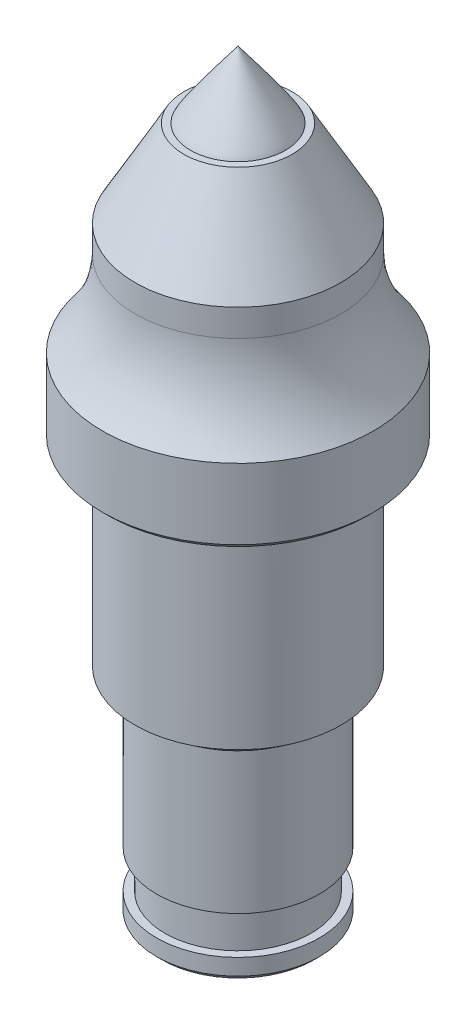
ISO-10303-21;
HEADER;
FILE_DESCRIPTION(('STEP AP214'),'2;1');
FILE_NAME('part.step','',(''),(''),'','','');
FILE_SCHEMA(('AUTOMOTIVE_DESIGN { 1 0 10303 214 1 1 1 1 }'));
ENDSEC;
DATA;
#1=APPLICATION_CONTEXT('core data for automotive mechanical design processes');
#2=APPLICATION_PROTOCOL_DEFINITION('international standard','automotive_design',2000,#1);
#3=PRODUCT_CONTEXT('',#1,'mechanical');
#4=PRODUCT('Part','Part','',(#3));
#5=PRODUCT_RELATED_PRODUCT_CATEGORY('part','',(#4));
#6=PRODUCT_DEFINITION_FORMATION('','',#4);
#7=PRODUCT_DEFINITION_CONTEXT('part definition',#1,'design');
#8=PRODUCT_DEFINITION('design','',#6,#7);
#9=PRODUCT_DEFINITION_SHAPE('','',#8);
#10=(LENGTH_UNIT() NAMED_UNIT(*) SI_UNIT(.MILLI.,.METRE.));
#11=(NAMED_UNIT(*) PLANE_ANGLE_UNIT() SI_UNIT($,.RADIAN.));
#12=(NAMED_UNIT(*) SI_UNIT($,.STERADIAN.) SOLID_ANGLE_UNIT());
#13=UNCERTAINTY_MEASURE_WITH_UNIT(LENGTH_MEASURE(1.E-05),#10,'distance_accuracy_value','');
#14=(GEOMETRIC_REPRESENTATION_CONTEXT(3) GLOBAL_UNCERTAINTY_ASSIGNED_CONTEXT((#13)) GLOBAL_UNIT_ASSIGNED_CONTEXT((#10,
#11,#12)) REPRESENTATION_CONTEXT('',''));
#15=CARTESIAN_POINT('',(0.,0.,0.));
#16=DIRECTION('',(0.,0.,1.));
#17=DIRECTION('',(1.,0.,0.));
#18=AXIS2_PLACEMENT_3D('',#15,#16,#17);
#19=CARTESIAN_POINT('',(0.,65.9448197262769,0.));
#20=CARTESIAN_POINT('',(-8.04656544206199,55.3071169285106,0.));
#21=CARTESIAN_POINT('',(-8.75,53.6426451032386,0.));
#22=B_SPLINE_CURVE_WITH_KNOTS('',2,(#19,#20,#21),.UNSPECIFIED.,.F.,.F.,(3,3),(0.,1.),.UNSPECIFIED.);
#23=CARTESIAN_POINT('',(0.,65.9448197262769,0.));
#24=DIRECTION('',(0.,1.,0.));
#25=AXIS1_PLACEMENT('',#23,#24);
#26=SURFACE_OF_REVOLUTION('',#22,#25);
#27=CARTESIAN_POINT('',(0.,53.6426451032386,0.));
#28=DIRECTION('',(0.,1.,0.));
#29=DIRECTION('',(-1.,0.,0.));
#30=AXIS2_PLACEMENT_3D('',#27,#28,#29);
#31=CIRCLE('',#30,8.75);
#32=CARTESIAN_POINT('',(-8.75,53.6426451032386,0.));
#33=VERTEX_POINT('',#32);
#34=EDGE_CURVE('E110',#33,#33,#31,.T.);
#35=ORIENTED_EDGE('',*,*,#34,.T.);
#36=EDGE_LOOP('',(#35));
#37=FACE_BOUND('',#36,.T.);
#38=CARTESIAN_POINT('',(0.,65.9448197262769,0.));
#39=VERTEX_POINT('',#38);
#40=VERTEX_LOOP('',#39);
#41=FACE_BOUND('',#40,.T.);
#42=ADVANCED_FACE('F43',(#37,#41),#26,.F.);
#43=CARTESIAN_POINT('',(-10.,53.6426451032386,0.));
#44=DIRECTION('',(0.,1.,0.));
#45=DIRECTION('',(-1.,0.,0.));
#46=AXIS2_PLACEMENT_3D('',#43,#44,#45);
#47=PLANE('',#46);
#48=CARTESIAN_POINT('',(0.,53.6426451032386,0.));
#49=DIRECTION('',(0.,1.,0.));
#50=DIRECTION('',(-1.,0.,0.));
#51=AXIS2_PLACEMENT_3D('',#48,#49,#50);
#52=CIRCLE('',#51,10.);
#53=CARTESIAN_POINT('',(-10.,53.6426451032386,0.));
#54=VERTEX_POINT('',#53);
#55=EDGE_CURVE('E108',#54,#54,#52,.T.);
#56=ORIENTED_EDGE('',*,*,#55,.T.);
#57=EDGE_LOOP('',(#56));
#58=FACE_BOUND('',#57,.T.);
#59=ORIENTED_EDGE('',*,*,#34,.F.);
#60=EDGE_LOOP('',(#59));
#61=FACE_BOUND('',#60,.T.);
#62=ADVANCED_FACE('F56',(#58,#61),#47,.T.);
#63=CARTESIAN_POINT('',(0.,53.6426451032386,0.));
#64=DIRECTION('',(0.,-1.,0.));
#65=DIRECTION('',(1.,0.,0.));
#66=AXIS2_PLACEMENT_3D('',#63,#64,#65);
#67=CONICAL_SURFACE('',#66,10.,0.512389460310738);
#68=CARTESIAN_POINT('',(0.,37.6426451032386,0.));
#69=DIRECTION('',(0.,1.,0.));
#70=DIRECTION('',(-1.,0.,0.));
#71=AXIS2_PLACEMENT_3D('',#68,#69,#70);
#72=CIRCLE('',#71,19.);
#73=CARTESIAN_POINT('',(-19.,37.6426451032386,0.));
#74=VERTEX_POINT('',#73);
#75=EDGE_CURVE('E105',#74,#74,#72,.T.);
#76=ORIENTED_EDGE('',*,*,#75,.T.);
#77=EDGE_LOOP('',(#76));
#78=FACE_BOUND('',#77,.T.);
#79=ORIENTED_EDGE('',*,*,#55,.F.);
#80=EDGE_LOOP('',(#79));
#81=FACE_BOUND('',#80,.T.);
#82=ADVANCED_FACE('F62',(#78,#81),#67,.T.);
#83=CARTESIAN_POINT('',(0.,65.9448197262769,0.));
#84=DIRECTION('',(0.,1.,0.));
#85=DIRECTION('',(-1.,0.,0.));
#86=AXIS2_PLACEMENT_3D('',#83,#84,#85);
#87=CYLINDRICAL_SURFACE('',#86,19.);
#88=CARTESIAN_POINT('',(0.,32.6426451032386,0.));
#89=DIRECTION('',(0.,1.,0.));
#90=DIRECTION('',(-1.,0.,0.));
#91=AXIS2_PLACEMENT_3D('',#88,#89,#90);
#92=CIRCLE('',#91,19.);
#93=CARTESIAN_POINT('',(-19.,32.6426451032386,0.));
#94=VERTEX_POINT('',#93);
#95=EDGE_CURVE('E116',#94,#94,#92,.T.);
#96=ORIENTED_EDGE('',*,*,#95,.T.);
#97=EDGE_LOOP('',(#96));
#98=FACE_BOUND('',#97,.T.);
#99=ORIENTED_EDGE('',*,*,#75,.F.);
#100=EDGE_LOOP('',(#99));
#101=FACE_BOUND('',#100,.T.);
#102=ADVANCED_FACE('F93',(#98,#101),#87,.T.);
#103=CARTESIAN_POINT('',(-19.,32.6426451032386,0.));
#104=CARTESIAN_POINT('',(-19.2445508071432,23.9822107419735,0.));
#105=CARTESIAN_POINT('',(-25.,16.9448197262769,0.));
#106=B_SPLINE_CURVE_WITH_KNOTS('',2,(#103,#104,#105),.UNSPECIFIED.,.F.,.F.,(3,3),(0.,1.),.UNSPECIFIED.);
#107=CARTESIAN_POINT('',(0.,65.9448197262769,0.));
#108=DIRECTION('',(0.,1.,0.));
#109=AXIS1_PLACEMENT('',#107,#108);
#110=SURFACE_OF_REVOLUTION('',#106,#109);
#111=CARTESIAN_POINT('',(0.,16.9448197262769,0.));
#112=DIRECTION('',(0.,1.,0.));
#113=DIRECTION('',(-1.,0.,0.));
#114=AXIS2_PLACEMENT_3D('',#111,#112,#113);
#115=CIRCLE('',#114,25.);
#116=CARTESIAN_POINT('',(-25.,16.9448197262769,0.));
#117=VERTEX_POINT('',#116);
#118=EDGE_CURVE('E198',#117,#117,#115,.T.);
#119=ORIENTED_EDGE('',*,*,#118,.T.);
#120=EDGE_LOOP('',(#119));
#121=FACE_BOUND('',#120,.T.);
#122=ORIENTED_EDGE('',*,*,#95,.F.);
#123=EDGE_LOOP('',(#122));
#124=FACE_BOUND('',#123,.T.);
#125=ADVANCED_FACE('F88',(#121,#124),#110,.F.);
#126=CARTESIAN_POINT('',(0.,65.9448197262769,0.));
#127=DIRECTION('',(0.,1.,0.));
#128=DIRECTION('',(-1.,0.,0.));
#129=AXIS2_PLACEMENT_3D('',#126,#127,#128);
#130=CYLINDRICAL_SURFACE('',#129,25.);
#131=CARTESIAN_POINT('',(0.,3.9448197262769,0.));
#132=DIRECTION('',(0.,-1.,0.));
#133=DIRECTION('',(1.,0.,0.));
#134=AXIS2_PLACEMENT_3D('',#131,#132,#133);
#135=CIRCLE('',#134,25.);
#136=CARTESIAN_POINT('',(25.,3.94481972627691,0.));
#137=VERTEX_POINT('',#136);
#138=EDGE_CURVE('E114',#137,#137,#135,.F.);
#139=ORIENTED_EDGE('',*,*,#138,.T.);
#140=EDGE_LOOP('',(#139));
#141=FACE_BOUND('',#140,.T.);
#142=ORIENTED_EDGE('',*,*,#118,.F.);
#143=EDGE_LOOP('',(#142));
#144=FACE_BOUND('',#143,.T.);
#145=ADVANCED_FACE('F92',(#141,#144),#130,.T.);
#146=CARTESIAN_POINT('',(-19.,2.9448197262769,0.));
#147=DIRECTION('',(0.,-1.,0.));
#148=DIRECTION('',(1.,0.,0.));
#149=AXIS2_PLACEMENT_3D('',#146,#147,#148);
#150=PLANE('',#149);
#151=CARTESIAN_POINT('',(0.,2.9448197262769,0.));
#152=DIRECTION('',(0.,-1.,0.));
#153=DIRECTION('',(1.,0.,0.));
#154=AXIS2_PLACEMENT_3D('',#151,#152,#153);
#155=CIRCLE('',#154,21.);
#156=CARTESIAN_POINT('',(21.,2.94481972627691,0.));
#157=VERTEX_POINT('',#156);
#158=EDGE_CURVE('E127',#157,#157,#155,.F.);
#159=ORIENTED_EDGE('',*,*,#158,.T.);
#160=EDGE_LOOP('',(#159));
#161=FACE_BOUND('',#160,.T.);
#162=CARTESIAN_POINT('',(0.,2.9448197262769,0.));
#163=DIRECTION('',(0.,-1.,0.));
#164=DIRECTION('',(1.,0.,0.));
#165=AXIS2_PLACEMENT_3D('',#162,#163,#164);
#166=CIRCLE('',#165,24.);
#167=CARTESIAN_POINT('',(24.,2.94481972627691,0.));
#168=VERTEX_POINT('',#167);
#169=EDGE_CURVE('E123',#168,#168,#166,.T.);
#170=ORIENTED_EDGE('',*,*,#169,.T.);
#171=EDGE_LOOP('',(#170));
#172=FACE_BOUND('',#171,.T.);
#173=ADVANCED_FACE('F182',(#161,#172),#150,.T.);
#174=CARTESIAN_POINT('',(0.,65.9448197262769,0.));
#175=DIRECTION('',(0.,1.,0.));
#176=DIRECTION('',(-1.,0.,0.));
#177=AXIS2_PLACEMENT_3D('',#174,#175,#176);
#178=CYLINDRICAL_SURFACE('',#177,19.);
#179=CARTESIAN_POINT('',(0.,0.944819726276899,0.));
#180=DIRECTION('',(0.,-1.,0.));
#181=DIRECTION('',(1.,0.,0.));
#182=AXIS2_PLACEMENT_3D('',#179,#180,#181);
#183=CIRCLE('',#182,19.);
#184=CARTESIAN_POINT('',(19.,0.944819726276902,0.));
#185=VERTEX_POINT('',#184);
#186=EDGE_CURVE('E131',#185,#185,#183,.T.);
#187=ORIENTED_EDGE('',*,*,#186,.T.);
#188=EDGE_LOOP('',(#187));
#189=FACE_BOUND('',#188,.T.);
#190=CARTESIAN_POINT('',(0.,-33.0551802737231,0.));
#191=DIRECTION('',(0.,1.,0.));
#192=DIRECTION('',(-1.,0.,0.));
#193=AXIS2_PLACEMENT_3D('',#190,#191,#192);
#194=CIRCLE('',#193,19.);
#195=CARTESIAN_POINT('',(-19.,-33.0551802737231,0.));
#196=VERTEX_POINT('',#195);
#197=EDGE_CURVE('E200',#196,#196,#194,.T.);
#198=ORIENTED_EDGE('',*,*,#197,.T.);
#199=EDGE_LOOP('',(#198));
#200=FACE_BOUND('',#199,.T.);
#201=ADVANCED_FACE('F179',(#189,#200),#178,.T.);
#202=CARTESIAN_POINT('',(0.,-33.0551802737231,0.));
#203=DIRECTION('',(0.,1.,0.));
#204=DIRECTION('',(-1.,0.,0.));
#205=AXIS2_PLACEMENT_3D('',#202,#203,#204);
#206=CONICAL_SURFACE('',#205,19.,0.927295218001612);
#207=CARTESIAN_POINT('',(0.,-36.0551802737231,0.));
#208=DIRECTION('',(0.,1.,0.));
#209=DIRECTION('',(-1.,0.,0.));
#210=AXIS2_PLACEMENT_3D('',#207,#208,#209);
#211=CIRCLE('',#210,15.);
#212=CARTESIAN_POINT('',(-15.,-36.0551802737231,0.));
#213=VERTEX_POINT('',#212);
#214=EDGE_CURVE('E206',#213,#213,#211,.T.);
#215=ORIENTED_EDGE('',*,*,#214,.T.);
#216=EDGE_LOOP('',(#215));
#217=FACE_BOUND('',#216,.T.);
#218=ORIENTED_EDGE('',*,*,#197,.F.);
#219=EDGE_LOOP('',(#218));
#220=FACE_BOUND('',#219,.T.);
#221=ADVANCED_FACE('F175',(#217,#220),#206,.T.);
#222=CARTESIAN_POINT('',(0.,65.9448197262769,0.));
#223=DIRECTION('',(0.,1.,0.));
#224=DIRECTION('',(-1.,0.,0.));
#225=AXIS2_PLACEMENT_3D('',#222,#223,#224);
#226=CYLINDRICAL_SURFACE('',#225,15.);
#227=CARTESIAN_POINT('',(0.,-62.0551802737231,0.));
#228=DIRECTION('',(0.,1.,0.));
#229=DIRECTION('',(-1.,0.,0.));
#230=AXIS2_PLACEMENT_3D('',#227,#228,#229);
#231=CIRCLE('',#230,15.);
#232=CARTESIAN_POINT('',(-15.,-62.0551802737231,0.));
#233=VERTEX_POINT('',#232);
#234=EDGE_CURVE('E212',#233,#233,#231,.T.);
#235=ORIENTED_EDGE('',*,*,#234,.T.);
#236=EDGE_LOOP('',(#235));
#237=FACE_BOUND('',#236,.T.);
#238=ORIENTED_EDGE('',*,*,#214,.F.);
#239=EDGE_LOOP('',(#238));
#240=FACE_BOUND('',#239,.T.);
#241=ADVANCED_FACE('F171',(#237,#240),#226,.T.);
#242=CARTESIAN_POINT('',(-13.5,-62.0551802737231,0.));
#243=DIRECTION('',(0.,-1.,0.));
#244=DIRECTION('',(1.,0.,0.));
#245=AXIS2_PLACEMENT_3D('',#242,#243,#244);
#246=PLANE('',#245);
#247=CARTESIAN_POINT('',(0.,-62.0551802737231,0.));
#248=DIRECTION('',(0.,1.,0.));
#249=DIRECTION('',(-1.,0.,0.));
#250=AXIS2_PLACEMENT_3D('',#247,#248,#249);
#251=CIRCLE('',#250,13.5);
#252=CARTESIAN_POINT('',(-13.5,-62.0551802737231,0.));
#253=VERTEX_POINT('',#252);
#254=EDGE_CURVE('E216',#253,#253,#251,.T.);
#255=ORIENTED_EDGE('',*,*,#254,.T.);
#256=EDGE_LOOP('',(#255));
#257=FACE_BOUND('',#256,.T.);
#258=ORIENTED_EDGE('',*,*,#234,.F.);
#259=EDGE_LOOP('',(#258));
#260=FACE_BOUND('',#259,.T.);
#261=ADVANCED_FACE('F167',(#257,#260),#246,.T.);
#262=CARTESIAN_POINT('',(0.,65.9448197262769,0.));
#263=DIRECTION('',(0.,1.,0.));
#264=DIRECTION('',(-1.,0.,0.));
#265=AXIS2_PLACEMENT_3D('',#262,#263,#264);
#266=CYLINDRICAL_SURFACE('',#265,13.5);
#267=CARTESIAN_POINT('',(0.,-69.0551802737231,0.));
#268=DIRECTION('',(0.,1.,0.));
#269=DIRECTION('',(-1.,0.,0.));
#270=AXIS2_PLACEMENT_3D('',#267,#268,#269);
#271=CIRCLE('',#270,13.5);
#272=CARTESIAN_POINT('',(-13.5,-69.0551802737231,0.));
#273=VERTEX_POINT('',#272);
#274=EDGE_CURVE('E219',#273,#273,#271,.T.);
#275=ORIENTED_EDGE('',*,*,#274,.T.);
#276=EDGE_LOOP('',(#275));
#277=FACE_BOUND('',#276,.T.);
#278=ORIENTED_EDGE('',*,*,#254,.F.);
#279=EDGE_LOOP('',(#278));
#280=FACE_BOUND('',#279,.T.);
#281=ADVANCED_FACE('F163',(#277,#280),#266,.T.);
#282=CARTESIAN_POINT('',(-15.,-69.0551802737231,0.));
#283=DIRECTION('',(0.,1.,0.));
#284=DIRECTION('',(-1.,0.,0.));
#285=AXIS2_PLACEMENT_3D('',#282,#283,#284);
#286=PLANE('',#285);
#287=CARTESIAN_POINT('',(0.,-69.0551802737231,0.));
#288=DIRECTION('',(0.,1.,0.));
#289=DIRECTION('',(-1.,0.,0.));
#290=AXIS2_PLACEMENT_3D('',#287,#288,#289);
#291=CIRCLE('',#290,15.);
#292=CARTESIAN_POINT('',(-15.,-69.0551802737231,0.));
#293=VERTEX_POINT('',#292);
#294=EDGE_CURVE('E82',#293,#293,#291,.T.);
#295=ORIENTED_EDGE('',*,*,#294,.T.);
#296=EDGE_LOOP('',(#295));
#297=FACE_BOUND('',#296,.T.);
#298=ORIENTED_EDGE('',*,*,#274,.F.);
#299=EDGE_LOOP('',(#298));
#300=FACE_BOUND('',#299,.T.);
#301=ADVANCED_FACE('F158',(#297,#300),#286,.T.);
#302=CARTESIAN_POINT('',(0.,65.9448197262769,0.));
#303=DIRECTION('',(0.,1.,0.));
#304=DIRECTION('',(-1.,0.,0.));
#305=AXIS2_PLACEMENT_3D('',#302,#303,#304);
#306=CYLINDRICAL_SURFACE('',#305,15.);
#307=CARTESIAN_POINT('',(0.,-72.055180273723,0.));
#308=DIRECTION('',(0.,-1.,0.));
#309=DIRECTION('',(1.,0.,0.));
#310=AXIS2_PLACEMENT_3D('',#307,#308,#309);
#311=CIRCLE('',#310,15.);
#312=CARTESIAN_POINT('',(15.,-72.055180273723,0.));
#313=VERTEX_POINT('',#312);
#314=EDGE_CURVE('E52',#313,#313,#311,.F.);
#315=ORIENTED_EDGE('',*,*,#314,.T.);
#316=EDGE_LOOP('',(#315));
#317=FACE_BOUND('',#316,.T.);
#318=ORIENTED_EDGE('',*,*,#294,.F.);
#319=EDGE_LOOP('',(#318));
#320=FACE_BOUND('',#319,.T.);
#321=ADVANCED_FACE('F138',(#317,#320),#306,.T.);
#322=CARTESIAN_POINT('',(0.,-73.0551802737231,0.));
#323=DIRECTION('',(0.,-1.,0.));
#324=DIRECTION('',(1.,0.,0.));
#325=AXIS2_PLACEMENT_3D('',#322,#323,#324);
#326=PLANE('',#325);
#327=CARTESIAN_POINT('',(0.,-73.0551802737231,0.));
#328=DIRECTION('',(0.,-1.,0.));
#329=DIRECTION('',(1.,0.,0.));
#330=AXIS2_PLACEMENT_3D('',#327,#328,#329);
#331=CIRCLE('',#330,14.);
#332=CARTESIAN_POINT('',(14.,-73.0551802737231,0.));
#333=VERTEX_POINT('',#332);
#334=EDGE_CURVE('E11',#333,#333,#331,.T.);
#335=ORIENTED_EDGE('',*,*,#334,.T.);
#336=EDGE_LOOP('',(#335));
#337=FACE_BOUND('',#336,.T.);
#338=ADVANCED_FACE('F150',(#337),#326,.T.);
#339=CARTESIAN_POINT('',(0.,3.94481972627691,0.));
#340=DIRECTION('',(0.,1.,0.));
#341=DIRECTION('',(-1.,0.,0.));
#342=AXIS2_PLACEMENT_3D('',#339,#340,#341);
#343=CONICAL_SURFACE('',#342,25.,0.785398163397457);
#344=ORIENTED_EDGE('',*,*,#169,.F.);
#345=EDGE_LOOP('',(#344));
#346=FACE_BOUND('',#345,.T.);
#347=ORIENTED_EDGE('',*,*,#138,.F.);
#348=EDGE_LOOP('',(#347));
#349=FACE_BOUND('',#348,.T.);
#350=ADVANCED_FACE('F70',(#346,#349),#343,.T.);
#351=CARTESIAN_POINT('',(0.,0.944819726276899,0.));
#352=DIRECTION('',(0.,-1.,0.));
#353=DIRECTION('',(1.,0.,0.));
#354=AXIS2_PLACEMENT_3D('',#351,#352,#353);
#355=TOROIDAL_SURFACE('',#354,21.,2.);
#356=ORIENTED_EDGE('',*,*,#186,.F.);
#357=EDGE_LOOP('',(#356));
#358=FACE_BOUND('',#357,.T.);
#359=ORIENTED_EDGE('',*,*,#158,.F.);
#360=EDGE_LOOP('',(#359));
#361=FACE_BOUND('',#360,.T.);
#362=ADVANCED_FACE('F142',(#358,#361),#355,.F.);
#363=CARTESIAN_POINT('',(0.,-72.055180273723,0.));
#364=DIRECTION('',(0.,1.,0.));
#365=DIRECTION('',(-1.,0.,0.));
#366=AXIS2_PLACEMENT_3D('',#363,#364,#365);
#367=CONICAL_SURFACE('',#366,15.,0.785398163397436);
#368=ORIENTED_EDGE('',*,*,#334,.F.);
#369=EDGE_LOOP('',(#368));
#370=FACE_BOUND('',#369,.T.);
#371=ORIENTED_EDGE('',*,*,#314,.F.);
#372=EDGE_LOOP('',(#371));
#373=FACE_BOUND('',#372,.T.);
#374=ADVANCED_FACE('F46',(#370,#373),#367,.T.);
#375=CLOSED_SHELL('',(#42,#62,#82,#102,#125,#145,#173,#201,#221,#241,#261,#281,#301,#321,#338,
#350,#362,#374));
#376=MANIFOLD_SOLID_BREP('B2',#375);
#377=ADVANCED_BREP_SHAPE_REPRESENTATION('',(#18,#376),#14);
#378=SHAPE_DEFINITION_REPRESENTATION(#9,#377);
ENDSEC;
END-ISO-10303-21;
